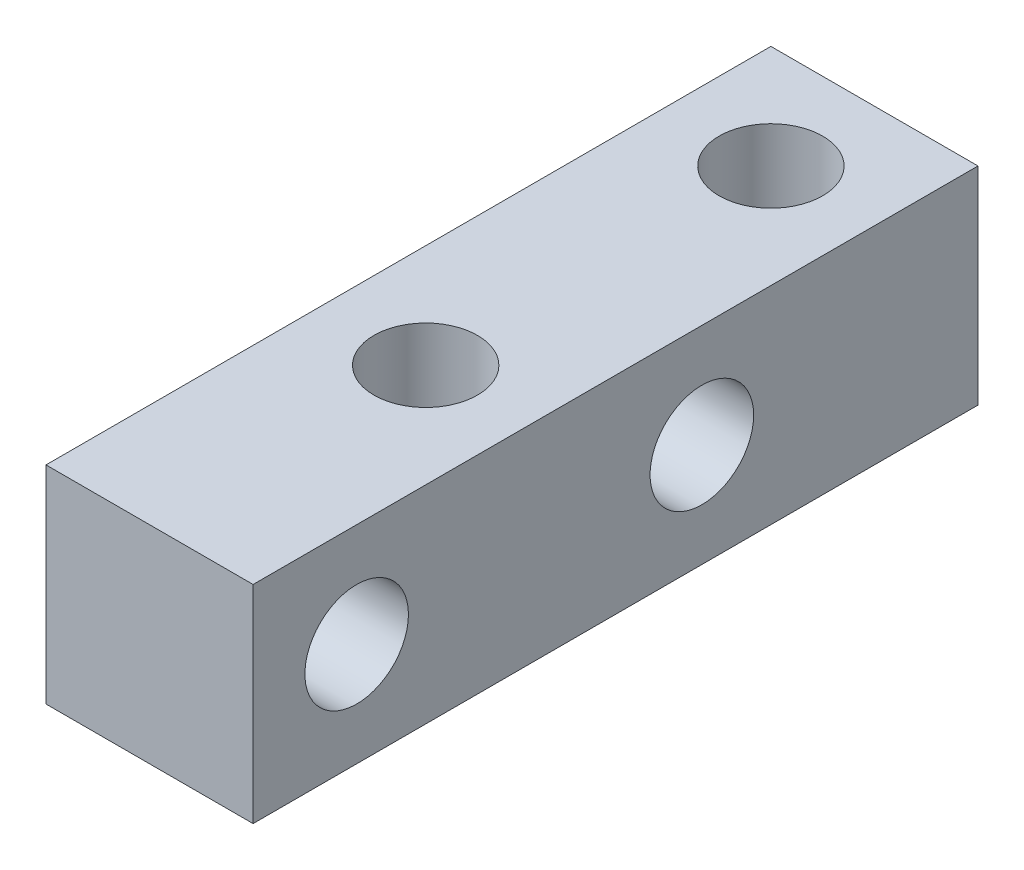
ISO-10303-21;
HEADER;
FILE_DESCRIPTION(('STEP AP214'),'2;1');
FILE_NAME('part.step','',(''),(''),'','','');
FILE_SCHEMA(('AUTOMOTIVE_DESIGN { 1 0 10303 214 1 1 1 1 }'));
ENDSEC;
DATA;
#1=APPLICATION_CONTEXT('core data for automotive mechanical design processes');
#2=APPLICATION_PROTOCOL_DEFINITION('international standard','automotive_design',2000,#1);
#3=PRODUCT_CONTEXT('',#1,'mechanical');
#4=PRODUCT('Part','Part','',(#3));
#5=PRODUCT_RELATED_PRODUCT_CATEGORY('part','',(#4));
#6=PRODUCT_DEFINITION_FORMATION('','',#4);
#7=PRODUCT_DEFINITION_CONTEXT('part definition',#1,'design');
#8=PRODUCT_DEFINITION('design','',#6,#7);
#9=PRODUCT_DEFINITION_SHAPE('','',#8);
#10=(LENGTH_UNIT() NAMED_UNIT(*) SI_UNIT(.MILLI.,.METRE.));
#11=(NAMED_UNIT(*) PLANE_ANGLE_UNIT() SI_UNIT($,.RADIAN.));
#12=(NAMED_UNIT(*) SI_UNIT($,.STERADIAN.) SOLID_ANGLE_UNIT());
#13=UNCERTAINTY_MEASURE_WITH_UNIT(LENGTH_MEASURE(1.E-05),#10,'distance_accuracy_value','');
#14=(GEOMETRIC_REPRESENTATION_CONTEXT(3) GLOBAL_UNCERTAINTY_ASSIGNED_CONTEXT((#13)) GLOBAL_UNIT_ASSIGNED_CONTEXT((#10,
#11,#12)) REPRESENTATION_CONTEXT('',''));
#15=CARTESIAN_POINT('',(0.,0.,0.));
#16=DIRECTION('',(0.,0.,1.));
#17=DIRECTION('',(1.,0.,0.));
#18=AXIS2_PLACEMENT_3D('',#15,#16,#17);
#19=CARTESIAN_POINT('',(3.,-3.,21.));
#20=DIRECTION('',(-1.,0.,0.));
#21=DIRECTION('',(0.,0.,1.));
#22=AXIS2_PLACEMENT_3D('',#19,#20,#21);
#23=PLANE('',#22);
#24=CARTESIAN_POINT('',(3.,0.,18.));
#25=DIRECTION('',(1.,0.,0.));
#26=DIRECTION('',(0.,0.,-1.));
#27=AXIS2_PLACEMENT_3D('',#24,#25,#26);
#28=CIRCLE('',#27,1.5);
#29=CARTESIAN_POINT('',(3.,0.,16.5));
#30=VERTEX_POINT('',#29);
#31=EDGE_CURVE('E133',#30,#30,#28,.T.);
#32=ORIENTED_EDGE('',*,*,#31,.F.);
#33=EDGE_LOOP('',(#32));
#34=FACE_BOUND('',#33,.T.);
#35=CARTESIAN_POINT('',(3.,0.,8.));
#36=DIRECTION('',(1.,0.,0.));
#37=DIRECTION('',(0.,0.,-1.));
#38=AXIS2_PLACEMENT_3D('',#35,#36,#37);
#39=CIRCLE('',#38,1.5);
#40=CARTESIAN_POINT('',(3.,0.,6.5));
#41=VERTEX_POINT('',#40);
#42=EDGE_CURVE('E130',#41,#41,#39,.T.);
#43=ORIENTED_EDGE('',*,*,#42,.F.);
#44=EDGE_LOOP('',(#43));
#45=FACE_BOUND('',#44,.T.);
#46=DIRECTION('',(0.,1.,0.));
#47=VECTOR('',#46,1.);
#48=CARTESIAN_POINT('',(3.,-3.,0.));
#49=LINE('',#48,#47);
#50=CARTESIAN_POINT('',(3.,-3.,0.));
#51=VERTEX_POINT('',#50);
#52=CARTESIAN_POINT('',(3.,3.,0.));
#53=VERTEX_POINT('',#52);
#54=EDGE_CURVE('E104',#51,#53,#49,.T.);
#55=ORIENTED_EDGE('',*,*,#54,.T.);
#56=DIRECTION('',(0.,0.,-1.));
#57=VECTOR('',#56,1.);
#58=CARTESIAN_POINT('',(3.,3.,21.));
#59=LINE('',#58,#57);
#60=CARTESIAN_POINT('',(3.,3.,21.));
#61=VERTEX_POINT('',#60);
#62=EDGE_CURVE('E11',#61,#53,#59,.T.);
#63=ORIENTED_EDGE('',*,*,#62,.F.);
#64=DIRECTION('',(0.,1.,0.));
#65=VECTOR('',#64,1.);
#66=CARTESIAN_POINT('',(3.,-3.,21.));
#67=LINE('',#66,#65);
#68=CARTESIAN_POINT('',(3.,-3.,21.));
#69=VERTEX_POINT('',#68);
#70=EDGE_CURVE('E92',#69,#61,#67,.T.);
#71=ORIENTED_EDGE('',*,*,#70,.F.);
#72=DIRECTION('',(0.,0.,-1.));
#73=VECTOR('',#72,1.);
#74=CARTESIAN_POINT('',(3.,-3.,21.));
#75=LINE('',#74,#73);
#76=EDGE_CURVE('E100',#69,#51,#75,.T.);
#77=ORIENTED_EDGE('',*,*,#76,.T.);
#78=EDGE_LOOP('',(#55,#63,#71,#77));
#79=FACE_BOUND('',#78,.T.);
#80=ADVANCED_FACE('F41',(#34,#45,#79),#23,.F.);
#81=CARTESIAN_POINT('',(-3.,3.,21.));
#82=DIRECTION('',(0.,-1.,0.));
#83=DIRECTION('',(0.,0.,-1.));
#84=AXIS2_PLACEMENT_3D('',#81,#82,#83);
#85=PLANE('',#84);
#86=CARTESIAN_POINT('',(0.,3.,3.));
#87=DIRECTION('',(0.,1.,0.));
#88=DIRECTION('',(0.,0.,1.));
#89=AXIS2_PLACEMENT_3D('',#86,#87,#88);
#90=CIRCLE('',#89,1.5);
#91=CARTESIAN_POINT('',(0.,3.,4.5));
#92=VERTEX_POINT('',#91);
#93=EDGE_CURVE('E121',#92,#92,#90,.T.);
#94=ORIENTED_EDGE('',*,*,#93,.F.);
#95=EDGE_LOOP('',(#94));
#96=FACE_BOUND('',#95,.T.);
#97=CARTESIAN_POINT('',(0.,3.,13.));
#98=DIRECTION('',(0.,1.,0.));
#99=DIRECTION('',(0.,0.,1.));
#100=AXIS2_PLACEMENT_3D('',#97,#98,#99);
#101=CIRCLE('',#100,1.5);
#102=CARTESIAN_POINT('',(0.,3.,14.5));
#103=VERTEX_POINT('',#102);
#104=EDGE_CURVE('E118',#103,#103,#101,.T.);
#105=ORIENTED_EDGE('',*,*,#104,.F.);
#106=EDGE_LOOP('',(#105));
#107=FACE_BOUND('',#106,.T.);
#108=DIRECTION('',(-1.,0.,0.));
#109=VECTOR('',#108,1.);
#110=CARTESIAN_POINT('',(-3.,3.,0.));
#111=LINE('',#110,#109);
#112=CARTESIAN_POINT('',(-3.,3.,0.));
#113=VERTEX_POINT('',#112);
#114=EDGE_CURVE('E96',#53,#113,#111,.T.);
#115=ORIENTED_EDGE('',*,*,#114,.T.);
#116=DIRECTION('',(0.,0.,-1.));
#117=VECTOR('',#116,1.);
#118=CARTESIAN_POINT('',(-3.,3.,21.));
#119=LINE('',#118,#117);
#120=CARTESIAN_POINT('',(-3.,3.,21.));
#121=VERTEX_POINT('',#120);
#122=EDGE_CURVE('E49',#121,#113,#119,.T.);
#123=ORIENTED_EDGE('',*,*,#122,.F.);
#124=DIRECTION('',(-1.,0.,0.));
#125=VECTOR('',#124,1.);
#126=CARTESIAN_POINT('',(-3.,3.,21.));
#127=LINE('',#126,#125);
#128=EDGE_CURVE('E87',#61,#121,#127,.T.);
#129=ORIENTED_EDGE('',*,*,#128,.F.);
#130=ORIENTED_EDGE('',*,*,#62,.T.);
#131=EDGE_LOOP('',(#115,#123,#129,#130));
#132=FACE_BOUND('',#131,.T.);
#133=ADVANCED_FACE('F95',(#96,#107,#132),#85,.F.);
#134=CARTESIAN_POINT('',(-3.,-3.,21.));
#135=DIRECTION('',(1.,0.,0.));
#136=DIRECTION('',(0.,0.,-1.));
#137=AXIS2_PLACEMENT_3D('',#134,#135,#136);
#138=PLANE('',#137);
#139=CARTESIAN_POINT('',(-3.,0.,18.));
#140=DIRECTION('',(1.,0.,0.));
#141=DIRECTION('',(0.,0.,-1.));
#142=AXIS2_PLACEMENT_3D('',#139,#140,#141);
#143=CIRCLE('',#142,1.5);
#144=CARTESIAN_POINT('',(-3.,0.,16.5));
#145=VERTEX_POINT('',#144);
#146=EDGE_CURVE('E125',#145,#145,#143,.F.);
#147=ORIENTED_EDGE('',*,*,#146,.F.);
#148=EDGE_LOOP('',(#147));
#149=FACE_BOUND('',#148,.T.);
#150=CARTESIAN_POINT('',(-3.,0.,8.));
#151=DIRECTION('',(1.,0.,0.));
#152=DIRECTION('',(0.,0.,-1.));
#153=AXIS2_PLACEMENT_3D('',#150,#151,#152);
#154=CIRCLE('',#153,1.5);
#155=CARTESIAN_POINT('',(-3.,0.,6.5));
#156=VERTEX_POINT('',#155);
#157=EDGE_CURVE('E134',#156,#156,#154,.F.);
#158=ORIENTED_EDGE('',*,*,#157,.F.);
#159=EDGE_LOOP('',(#158));
#160=FACE_BOUND('',#159,.T.);
#161=DIRECTION('',(0.,-1.,0.));
#162=VECTOR('',#161,1.);
#163=CARTESIAN_POINT('',(-3.,-3.,0.));
#164=LINE('',#163,#162);
#165=CARTESIAN_POINT('',(-3.,-3.,0.));
#166=VERTEX_POINT('',#165);
#167=EDGE_CURVE('E74',#113,#166,#164,.T.);
#168=ORIENTED_EDGE('',*,*,#167,.T.);
#169=DIRECTION('',(0.,0.,-1.));
#170=VECTOR('',#169,1.);
#171=CARTESIAN_POINT('',(-3.,-3.,21.));
#172=LINE('',#171,#170);
#173=CARTESIAN_POINT('',(-3.,-3.,21.));
#174=VERTEX_POINT('',#173);
#175=EDGE_CURVE('E97',#174,#166,#172,.T.);
#176=ORIENTED_EDGE('',*,*,#175,.F.);
#177=DIRECTION('',(0.,-1.,0.));
#178=VECTOR('',#177,1.);
#179=CARTESIAN_POINT('',(-3.,-3.,21.));
#180=LINE('',#179,#178);
#181=EDGE_CURVE('E90',#121,#174,#180,.T.);
#182=ORIENTED_EDGE('',*,*,#181,.F.);
#183=ORIENTED_EDGE('',*,*,#122,.T.);
#184=EDGE_LOOP('',(#168,#176,#182,#183));
#185=FACE_BOUND('',#184,.T.);
#186=ADVANCED_FACE('F98',(#149,#160,#185),#138,.F.);
#187=CARTESIAN_POINT('',(-3.,-3.,21.));
#188=DIRECTION('',(0.,1.,0.));
#189=DIRECTION('',(0.,0.,1.));
#190=AXIS2_PLACEMENT_3D('',#187,#188,#189);
#191=PLANE('',#190);
#192=CARTESIAN_POINT('',(0.,-3.,3.));
#193=DIRECTION('',(0.,1.,0.));
#194=DIRECTION('',(0.,0.,1.));
#195=AXIS2_PLACEMENT_3D('',#192,#193,#194);
#196=CIRCLE('',#195,1.5);
#197=CARTESIAN_POINT('',(0.,-3.,4.5));
#198=VERTEX_POINT('',#197);
#199=EDGE_CURVE('E107',#198,#198,#196,.F.);
#200=ORIENTED_EDGE('',*,*,#199,.F.);
#201=EDGE_LOOP('',(#200));
#202=FACE_BOUND('',#201,.T.);
#203=CARTESIAN_POINT('',(0.,-3.,13.));
#204=DIRECTION('',(0.,1.,0.));
#205=DIRECTION('',(0.,0.,1.));
#206=AXIS2_PLACEMENT_3D('',#203,#204,#205);
#207=CIRCLE('',#206,1.5);
#208=CARTESIAN_POINT('',(0.,-3.,14.5));
#209=VERTEX_POINT('',#208);
#210=EDGE_CURVE('E122',#209,#209,#207,.F.);
#211=ORIENTED_EDGE('',*,*,#210,.F.);
#212=EDGE_LOOP('',(#211));
#213=FACE_BOUND('',#212,.T.);
#214=DIRECTION('',(1.,0.,0.));
#215=VECTOR('',#214,1.);
#216=CARTESIAN_POINT('',(-3.,-3.,0.));
#217=LINE('',#216,#215);
#218=EDGE_CURVE('E80',#166,#51,#217,.T.);
#219=ORIENTED_EDGE('',*,*,#218,.T.);
#220=ORIENTED_EDGE('',*,*,#76,.F.);
#221=DIRECTION('',(1.,0.,0.));
#222=VECTOR('',#221,1.);
#223=CARTESIAN_POINT('',(-3.,-3.,21.));
#224=LINE('',#223,#222);
#225=EDGE_CURVE('E57',#174,#69,#224,.T.);
#226=ORIENTED_EDGE('',*,*,#225,.F.);
#227=ORIENTED_EDGE('',*,*,#175,.T.);
#228=EDGE_LOOP('',(#219,#220,#226,#227));
#229=FACE_BOUND('',#228,.T.);
#230=ADVANCED_FACE('F112',(#202,#213,#229),#191,.F.);
#231=CARTESIAN_POINT('',(0.,0.,21.));
#232=DIRECTION('',(0.,0.,-1.));
#233=DIRECTION('',(-1.,0.,0.));
#234=AXIS2_PLACEMENT_3D('',#231,#232,#233);
#235=PLANE('',#234);
#236=ORIENTED_EDGE('',*,*,#70,.T.);
#237=ORIENTED_EDGE('',*,*,#128,.T.);
#238=ORIENTED_EDGE('',*,*,#181,.T.);
#239=ORIENTED_EDGE('',*,*,#225,.T.);
#240=EDGE_LOOP('',(#236,#237,#238,#239));
#241=FACE_BOUND('',#240,.T.);
#242=ADVANCED_FACE('F88',(#241),#235,.F.);
#243=CARTESIAN_POINT('',(0.,0.,0.));
#244=DIRECTION('',(0.,0.,-1.));
#245=DIRECTION('',(-1.,0.,0.));
#246=AXIS2_PLACEMENT_3D('',#243,#244,#245);
#247=PLANE('',#246);
#248=ORIENTED_EDGE('',*,*,#54,.F.);
#249=ORIENTED_EDGE('',*,*,#218,.F.);
#250=ORIENTED_EDGE('',*,*,#167,.F.);
#251=ORIENTED_EDGE('',*,*,#114,.F.);
#252=EDGE_LOOP('',(#248,#249,#250,#251));
#253=FACE_BOUND('',#252,.T.);
#254=ADVANCED_FACE('F115',(#253),#247,.T.);
#255=CARTESIAN_POINT('',(0.,-7.24264068711928,13.));
#256=DIRECTION('',(0.,1.,0.));
#257=DIRECTION('',(0.,0.,1.));
#258=AXIS2_PLACEMENT_3D('',#255,#256,#257);
#259=CYLINDRICAL_SURFACE('',#258,1.5);
#260=ORIENTED_EDGE('',*,*,#210,.T.);
#261=EDGE_LOOP('',(#260));
#262=FACE_BOUND('',#261,.T.);
#263=ORIENTED_EDGE('',*,*,#104,.T.);
#264=EDGE_LOOP('',(#263));
#265=FACE_BOUND('',#264,.T.);
#266=ADVANCED_FACE('F160',(#262,#265),#259,.F.);
#267=CARTESIAN_POINT('',(0.,-7.24264068711928,3.));
#268=DIRECTION('',(0.,1.,0.));
#269=DIRECTION('',(0.,0.,1.));
#270=AXIS2_PLACEMENT_3D('',#267,#268,#269);
#271=CYLINDRICAL_SURFACE('',#270,1.5);
#272=ORIENTED_EDGE('',*,*,#199,.T.);
#273=EDGE_LOOP('',(#272));
#274=FACE_BOUND('',#273,.T.);
#275=ORIENTED_EDGE('',*,*,#93,.T.);
#276=EDGE_LOOP('',(#275));
#277=FACE_BOUND('',#276,.T.);
#278=ADVANCED_FACE('F150',(#274,#277),#271,.F.);
#279=CARTESIAN_POINT('',(-7.24264068711928,0.,8.));
#280=DIRECTION('',(1.,0.,0.));
#281=DIRECTION('',(0.,0.,-1.));
#282=AXIS2_PLACEMENT_3D('',#279,#280,#281);
#283=CYLINDRICAL_SURFACE('',#282,1.5);
#284=CARTESIAN_POINT('',(-3.,0.,6.5));
#285=CARTESIAN_POINT('',(-2.9375,0.,6.5));
#286=CARTESIAN_POINT('',(-2.875,0.,6.5));
#287=CARTESIAN_POINT('',(-2.75,0.,6.5));
#288=CARTESIAN_POINT('',(-2.6875,0.,6.5));
#289=CARTESIAN_POINT('',(-2.5625,0.,6.5));
#290=CARTESIAN_POINT('',(-2.5,0.,6.5));
#291=CARTESIAN_POINT('',(-2.375,0.,6.5));
#292=CARTESIAN_POINT('',(-2.3125,0.,6.5));
#293=CARTESIAN_POINT('',(-2.1875,0.,6.5));
#294=CARTESIAN_POINT('',(-2.125,0.,6.5));
#295=CARTESIAN_POINT('',(-2.,0.,6.5));
#296=CARTESIAN_POINT('',(-1.9375,0.,6.5));
#297=CARTESIAN_POINT('',(-1.8125,0.,6.5));
#298=CARTESIAN_POINT('',(-1.75,0.,6.5));
#299=CARTESIAN_POINT('',(-1.625,0.,6.5));
#300=CARTESIAN_POINT('',(-1.5625,0.,6.5));
#301=CARTESIAN_POINT('',(-1.4375,0.,6.5));
#302=CARTESIAN_POINT('',(-1.375,0.,6.5));
#303=CARTESIAN_POINT('',(-1.25,0.,6.5));
#304=CARTESIAN_POINT('',(-1.1875,0.,6.5));
#305=CARTESIAN_POINT('',(-1.0625,0.,6.5));
#306=CARTESIAN_POINT('',(-1.,0.,6.5));
#307=CARTESIAN_POINT('',(-0.875,0.,6.5));
#308=CARTESIAN_POINT('',(-0.8125,0.,6.5));
#309=CARTESIAN_POINT('',(-0.6875,0.,6.5));
#310=CARTESIAN_POINT('',(-0.625,0.,6.5));
#311=CARTESIAN_POINT('',(-0.5,0.,6.5));
#312=CARTESIAN_POINT('',(-0.4375,0.,6.5));
#313=CARTESIAN_POINT('',(-0.3125,0.,6.5));
#314=CARTESIAN_POINT('',(-0.25,0.,6.5));
#315=CARTESIAN_POINT('',(-0.125,0.,6.5));
#316=CARTESIAN_POINT('',(-0.0625,0.,6.5));
#317=CARTESIAN_POINT('',(0.0625,0.,6.5));
#318=CARTESIAN_POINT('',(0.125,0.,6.5));
#319=CARTESIAN_POINT('',(0.25,0.,6.5));
#320=CARTESIAN_POINT('',(0.3125,0.,6.5));
#321=CARTESIAN_POINT('',(0.4375,0.,6.5));
#322=CARTESIAN_POINT('',(0.5,0.,6.5));
#323=CARTESIAN_POINT('',(0.624999999999999,0.,6.5));
#324=CARTESIAN_POINT('',(0.687499999999999,0.,6.5));
#325=CARTESIAN_POINT('',(0.812499999999999,0.,6.5));
#326=CARTESIAN_POINT('',(0.874999999999999,0.,6.5));
#327=CARTESIAN_POINT('',(0.999999999999999,0.,6.5));
#328=CARTESIAN_POINT('',(1.0625,0.,6.5));
#329=CARTESIAN_POINT('',(1.1875,0.,6.5));
#330=CARTESIAN_POINT('',(1.25,0.,6.5));
#331=CARTESIAN_POINT('',(1.375,0.,6.5));
#332=CARTESIAN_POINT('',(1.4375,0.,6.5));
#333=CARTESIAN_POINT('',(1.5625,0.,6.5));
#334=CARTESIAN_POINT('',(1.625,0.,6.5));
#335=CARTESIAN_POINT('',(1.75,0.,6.5));
#336=CARTESIAN_POINT('',(1.8125,0.,6.5));
#337=CARTESIAN_POINT('',(1.9375,0.,6.5));
#338=CARTESIAN_POINT('',(2.,0.,6.5));
#339=CARTESIAN_POINT('',(2.125,0.,6.5));
#340=CARTESIAN_POINT('',(2.1875,0.,6.5));
#341=CARTESIAN_POINT('',(2.3125,0.,6.5));
#342=CARTESIAN_POINT('',(2.375,0.,6.5));
#343=CARTESIAN_POINT('',(2.5,0.,6.5));
#344=CARTESIAN_POINT('',(2.5625,0.,6.5));
#345=CARTESIAN_POINT('',(2.6875,0.,6.5));
#346=CARTESIAN_POINT('',(2.75,0.,6.5));
#347=CARTESIAN_POINT('',(2.875,0.,6.5));
#348=CARTESIAN_POINT('',(2.9375,0.,6.5));
#349=CARTESIAN_POINT('',(3.,0.,6.5));
#350=B_SPLINE_CURVE_WITH_KNOTS('',3,(#284,#285,#286,#287,#288,#289,#290,#291,#292,#293,#294,
#295,#296,#297,#298,#299,#300,#301,#302,#303,#304,#305,#306,#307,#308,#309,#310,#311,#312,#313,
#314,#315,#316,#317,#318,#319,#320,#321,#322,#323,#324,#325,#326,#327,#328,#329,#330,#331,#332,
#333,#334,#335,#336,#337,#338,#339,#340,#341,#342,#343,#344,#345,#346,#347,#348,#349),
.UNSPECIFIED.,.F.,.F.,(4,2,2,2,2,2,2,2,2,2,2,2,2,2,2,2,2,2,2,2,2,2,2,2,2,2,2,2,2,2,2,2,4),(0.,
0.1875,0.375,0.5625,0.75,0.9375,1.125,1.3125,1.5,1.6875,1.875,2.0625,2.25,2.4375,2.625,2.8125,
3.,3.1875,3.375,3.5625,3.75,3.9375,4.125,4.3125,4.5,4.6875,4.875,5.0625,5.25,5.4375,5.625,
5.8125,6.),.UNSPECIFIED.);
#351=EDGE_CURVE('BSEAM148',#156,#41,#350,.T.);
#352=ORIENTED_EDGE('',*,*,#157,.T.);
#353=ORIENTED_EDGE('',*,*,#42,.T.);
#354=ORIENTED_EDGE('',*,*,#351,.T.);
#355=ORIENTED_EDGE('',*,*,#351,.F.);
#356=EDGE_LOOP('',(#352,#354,#353,#355));
#357=FACE_BOUND('',#356,.T.);
#358=ADVANCED_FACE('F148',(#357),#283,.F.);
#359=CARTESIAN_POINT('',(-7.24264068711928,0.,18.));
#360=DIRECTION('',(1.,0.,0.));
#361=DIRECTION('',(0.,0.,-1.));
#362=AXIS2_PLACEMENT_3D('',#359,#360,#361);
#363=CYLINDRICAL_SURFACE('',#362,1.5);
#364=CARTESIAN_POINT('',(-3.,0.,16.5));
#365=CARTESIAN_POINT('',(-2.9375,0.,16.5));
#366=CARTESIAN_POINT('',(-2.875,0.,16.5));
#367=CARTESIAN_POINT('',(-2.75,0.,16.5));
#368=CARTESIAN_POINT('',(-2.6875,0.,16.5));
#369=CARTESIAN_POINT('',(-2.5625,0.,16.5));
#370=CARTESIAN_POINT('',(-2.5,0.,16.5));
#371=CARTESIAN_POINT('',(-2.375,0.,16.5));
#372=CARTESIAN_POINT('',(-2.3125,0.,16.5));
#373=CARTESIAN_POINT('',(-2.1875,0.,16.5));
#374=CARTESIAN_POINT('',(-2.125,0.,16.5));
#375=CARTESIAN_POINT('',(-2.,0.,16.5));
#376=CARTESIAN_POINT('',(-1.9375,0.,16.5));
#377=CARTESIAN_POINT('',(-1.8125,0.,16.5));
#378=CARTESIAN_POINT('',(-1.75,0.,16.5));
#379=CARTESIAN_POINT('',(-1.625,0.,16.5));
#380=CARTESIAN_POINT('',(-1.5625,0.,16.5));
#381=CARTESIAN_POINT('',(-1.4375,0.,16.5));
#382=CARTESIAN_POINT('',(-1.375,0.,16.5));
#383=CARTESIAN_POINT('',(-1.25,0.,16.5));
#384=CARTESIAN_POINT('',(-1.1875,0.,16.5));
#385=CARTESIAN_POINT('',(-1.0625,0.,16.5));
#386=CARTESIAN_POINT('',(-1.,0.,16.5));
#387=CARTESIAN_POINT('',(-0.875,0.,16.5));
#388=CARTESIAN_POINT('',(-0.8125,0.,16.5));
#389=CARTESIAN_POINT('',(-0.6875,0.,16.5));
#390=CARTESIAN_POINT('',(-0.625,0.,16.5));
#391=CARTESIAN_POINT('',(-0.5,0.,16.5));
#392=CARTESIAN_POINT('',(-0.4375,0.,16.5));
#393=CARTESIAN_POINT('',(-0.3125,0.,16.5));
#394=CARTESIAN_POINT('',(-0.25,0.,16.5));
#395=CARTESIAN_POINT('',(-0.125,0.,16.5));
#396=CARTESIAN_POINT('',(-0.0625,0.,16.5));
#397=CARTESIAN_POINT('',(0.0625,0.,16.5));
#398=CARTESIAN_POINT('',(0.125,0.,16.5));
#399=CARTESIAN_POINT('',(0.25,0.,16.5));
#400=CARTESIAN_POINT('',(0.3125,0.,16.5));
#401=CARTESIAN_POINT('',(0.4375,0.,16.5));
#402=CARTESIAN_POINT('',(0.5,0.,16.5));
#403=CARTESIAN_POINT('',(0.624999999999999,0.,16.5));
#404=CARTESIAN_POINT('',(0.687499999999999,0.,16.5));
#405=CARTESIAN_POINT('',(0.812499999999999,0.,16.5));
#406=CARTESIAN_POINT('',(0.874999999999999,0.,16.5));
#407=CARTESIAN_POINT('',(0.999999999999999,0.,16.5));
#408=CARTESIAN_POINT('',(1.0625,0.,16.5));
#409=CARTESIAN_POINT('',(1.1875,0.,16.5));
#410=CARTESIAN_POINT('',(1.25,0.,16.5));
#411=CARTESIAN_POINT('',(1.375,0.,16.5));
#412=CARTESIAN_POINT('',(1.4375,0.,16.5));
#413=CARTESIAN_POINT('',(1.5625,0.,16.5));
#414=CARTESIAN_POINT('',(1.625,0.,16.5));
#415=CARTESIAN_POINT('',(1.75,0.,16.5));
#416=CARTESIAN_POINT('',(1.8125,0.,16.5));
#417=CARTESIAN_POINT('',(1.9375,0.,16.5));
#418=CARTESIAN_POINT('',(2.,0.,16.5));
#419=CARTESIAN_POINT('',(2.125,0.,16.5));
#420=CARTESIAN_POINT('',(2.1875,0.,16.5));
#421=CARTESIAN_POINT('',(2.3125,0.,16.5));
#422=CARTESIAN_POINT('',(2.375,0.,16.5));
#423=CARTESIAN_POINT('',(2.5,0.,16.5));
#424=CARTESIAN_POINT('',(2.5625,0.,16.5));
#425=CARTESIAN_POINT('',(2.6875,0.,16.5));
#426=CARTESIAN_POINT('',(2.75,0.,16.5));
#427=CARTESIAN_POINT('',(2.875,0.,16.5));
#428=CARTESIAN_POINT('',(2.9375,0.,16.5));
#429=CARTESIAN_POINT('',(3.,0.,16.5));
#430=B_SPLINE_CURVE_WITH_KNOTS('',3,(#364,#365,#366,#367,#368,#369,#370,#371,#372,#373,#374,
#375,#376,#377,#378,#379,#380,#381,#382,#383,#384,#385,#386,#387,#388,#389,#390,#391,#392,#393,
#394,#395,#396,#397,#398,#399,#400,#401,#402,#403,#404,#405,#406,#407,#408,#409,#410,#411,#412,
#413,#414,#415,#416,#417,#418,#419,#420,#421,#422,#423,#424,#425,#426,#427,#428,#429),
.UNSPECIFIED.,.F.,.F.,(4,2,2,2,2,2,2,2,2,2,2,2,2,2,2,2,2,2,2,2,2,2,2,2,2,2,2,2,2,2,2,2,4),(0.,
0.1875,0.375,0.5625,0.75,0.9375,1.125,1.3125,1.5,1.6875,1.875,2.0625,2.25,2.4375,2.625,2.8125,
3.,3.1875,3.375,3.5625,3.75,3.9375,4.125,4.3125,4.5,4.6875,4.875,5.0625,5.25,5.4375,5.625,
5.8125,6.),.UNSPECIFIED.);
#431=EDGE_CURVE('BSEAM142',#145,#30,#430,.T.);
#432=ORIENTED_EDGE('',*,*,#146,.T.);
#433=ORIENTED_EDGE('',*,*,#31,.T.);
#434=ORIENTED_EDGE('',*,*,#431,.T.);
#435=ORIENTED_EDGE('',*,*,#431,.F.);
#436=EDGE_LOOP('',(#432,#434,#433,#435));
#437=FACE_BOUND('',#436,.T.);
#438=ADVANCED_FACE('F142',(#437),#363,.F.);
#439=CLOSED_SHELL('',(#80,#133,#186,#230,#242,#254,#266,#278,#358,#438));
#440=MANIFOLD_SOLID_BREP('B2',#439);
#441=ADVANCED_BREP_SHAPE_REPRESENTATION('',(#18,#440),#14);
#442=SHAPE_DEFINITION_REPRESENTATION(#9,#441);
ENDSEC;
END-ISO-10303-21;
